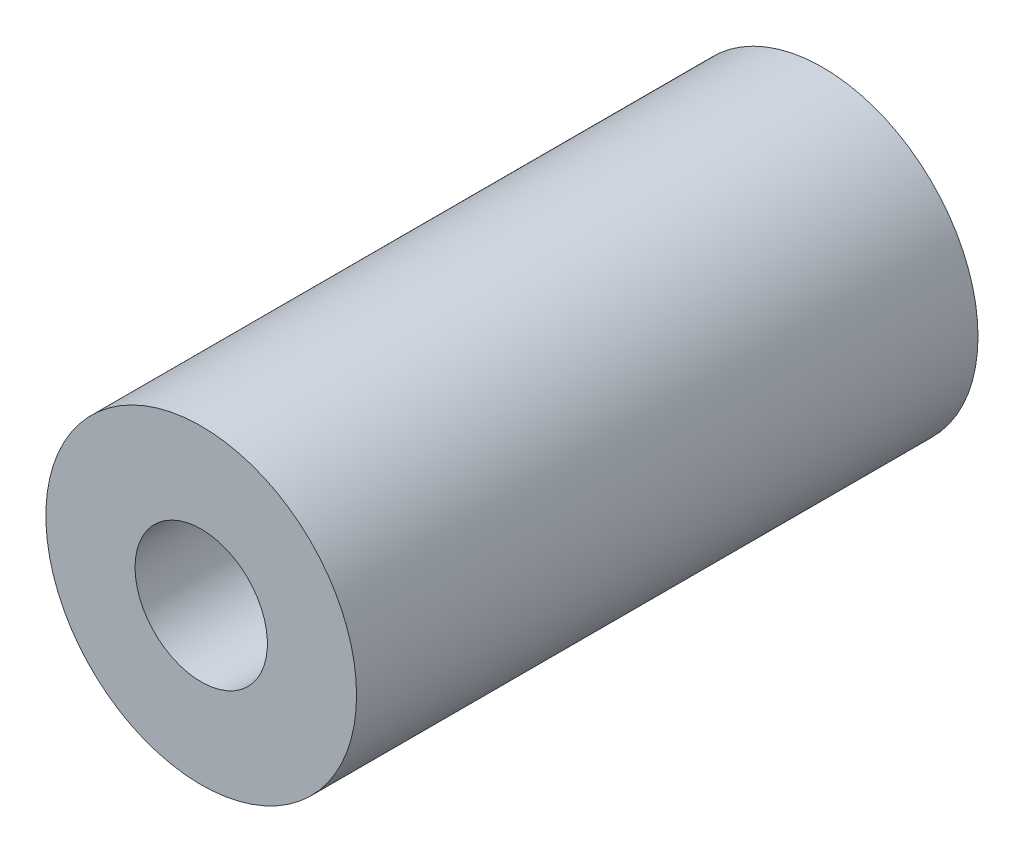
ISO-10303-21;
HEADER;
FILE_DESCRIPTION(('STEP AP214'),'2;1');
FILE_NAME('part.step','',(''),(''),'','','');
FILE_SCHEMA(('AUTOMOTIVE_DESIGN { 1 0 10303 214 1 1 1 1 }'));
ENDSEC;
DATA;
#1=APPLICATION_CONTEXT('core data for automotive mechanical design processes');
#2=APPLICATION_PROTOCOL_DEFINITION('international standard','automotive_design',2000,#1);
#3=PRODUCT_CONTEXT('',#1,'mechanical');
#4=PRODUCT('Part','Part','',(#3));
#5=PRODUCT_RELATED_PRODUCT_CATEGORY('part','',(#4));
#6=PRODUCT_DEFINITION_FORMATION('','',#4);
#7=PRODUCT_DEFINITION_CONTEXT('part definition',#1,'design');
#8=PRODUCT_DEFINITION('design','',#6,#7);
#9=PRODUCT_DEFINITION_SHAPE('','',#8);
#10=(LENGTH_UNIT() NAMED_UNIT(*) SI_UNIT(.MILLI.,.METRE.));
#11=(NAMED_UNIT(*) PLANE_ANGLE_UNIT() SI_UNIT($,.RADIAN.));
#12=(NAMED_UNIT(*) SI_UNIT($,.STERADIAN.) SOLID_ANGLE_UNIT());
#13=UNCERTAINTY_MEASURE_WITH_UNIT(LENGTH_MEASURE(1.E-05),#10,'distance_accuracy_value','');
#14=(GEOMETRIC_REPRESENTATION_CONTEXT(3) GLOBAL_UNCERTAINTY_ASSIGNED_CONTEXT((#13)) GLOBAL_UNIT_ASSIGNED_CONTEXT((#10,
#11,#12)) REPRESENTATION_CONTEXT('',''));
#15=CARTESIAN_POINT('',(0.,0.,0.));
#16=DIRECTION('',(0.,0.,1.));
#17=DIRECTION('',(1.,0.,0.));
#18=AXIS2_PLACEMENT_3D('',#15,#16,#17);
#19=CARTESIAN_POINT('',(0.,0.,12.7));
#20=DIRECTION('',(0.,0.,-1.));
#21=DIRECTION('',(-1.,0.,0.));
#22=AXIS2_PLACEMENT_3D('',#19,#20,#21);
#23=CYLINDRICAL_SURFACE('',#22,3.175);
#24=CARTESIAN_POINT('',(0.,0.,12.7));
#25=DIRECTION('',(0.,0.,1.));
#26=DIRECTION('',(1.,0.,0.));
#27=AXIS2_PLACEMENT_3D('',#24,#25,#26);
#28=CIRCLE('',#27,3.175);
#29=CARTESIAN_POINT('',(3.175,0.,12.7));
#30=VERTEX_POINT('',#29);
#31=EDGE_CURVE('E10',#30,#30,#28,.T.);
#32=ORIENTED_EDGE('',*,*,#31,.F.);
#33=EDGE_LOOP('',(#32));
#34=FACE_BOUND('',#33,.T.);
#35=CARTESIAN_POINT('',(0.,0.,0.));
#36=DIRECTION('',(0.,0.,1.));
#37=DIRECTION('',(1.,0.,0.));
#38=AXIS2_PLACEMENT_3D('',#35,#36,#37);
#39=CIRCLE('',#38,3.175);
#40=CARTESIAN_POINT('',(3.175,0.,0.));
#41=VERTEX_POINT('',#40);
#42=EDGE_CURVE('E36',#41,#41,#39,.T.);
#43=ORIENTED_EDGE('',*,*,#42,.T.);
#44=EDGE_LOOP('',(#43));
#45=FACE_BOUND('',#44,.T.);
#46=ADVANCED_FACE('F33',(#34,#45),#23,.T.);
#47=CARTESIAN_POINT('',(0.,0.,12.7));
#48=DIRECTION('',(0.,0.,1.));
#49=DIRECTION('',(1.,0.,0.));
#50=AXIS2_PLACEMENT_3D('',#47,#48,#49);
#51=PLANE('',#50);
#52=CARTESIAN_POINT('',(0.,0.,12.7));
#53=DIRECTION('',(0.,0.,-1.));
#54=DIRECTION('',(-1.,0.,0.));
#55=AXIS2_PLACEMENT_3D('',#52,#53,#54);
#56=CIRCLE('',#55,1.35255);
#57=CARTESIAN_POINT('',(-1.35255,0.,12.7));
#58=VERTEX_POINT('',#57);
#59=EDGE_CURVE('E43',#58,#58,#56,.T.);
#60=ORIENTED_EDGE('',*,*,#59,.T.);
#61=EDGE_LOOP('',(#60));
#62=FACE_BOUND('',#61,.T.);
#63=ORIENTED_EDGE('',*,*,#31,.T.);
#64=EDGE_LOOP('',(#63));
#65=FACE_BOUND('',#64,.T.);
#66=ADVANCED_FACE('F56',(#62,#65),#51,.T.);
#67=CARTESIAN_POINT('',(0.,0.,0.));
#68=DIRECTION('',(0.,0.,1.));
#69=DIRECTION('',(1.,0.,0.));
#70=AXIS2_PLACEMENT_3D('',#67,#68,#69);
#71=PLANE('',#70);
#72=CARTESIAN_POINT('',(0.,0.,0.));
#73=DIRECTION('',(0.,0.,-1.));
#74=DIRECTION('',(-1.,0.,0.));
#75=AXIS2_PLACEMENT_3D('',#72,#73,#74);
#76=CIRCLE('',#75,1.35254999999999);
#77=CARTESIAN_POINT('',(-1.35254999999999,0.,0.));
#78=VERTEX_POINT('',#77);
#79=EDGE_CURVE('E47',#78,#78,#76,.T.);
#80=ORIENTED_EDGE('',*,*,#79,.F.);
#81=EDGE_LOOP('',(#80));
#82=FACE_BOUND('',#81,.T.);
#83=ORIENTED_EDGE('',*,*,#42,.F.);
#84=EDGE_LOOP('',(#83));
#85=FACE_BOUND('',#84,.T.);
#86=ADVANCED_FACE('F53',(#82,#85),#71,.F.);
#87=CARTESIAN_POINT('',(0.,0.,0.));
#88=DIRECTION('',(0.,0.,-1.));
#89=DIRECTION('',(-1.,0.,0.));
#90=AXIS2_PLACEMENT_3D('',#87,#88,#89);
#91=CYLINDRICAL_SURFACE('',#90,1.35254999999999);
#92=ORIENTED_EDGE('',*,*,#59,.F.);
#93=EDGE_LOOP('',(#92));
#94=FACE_BOUND('',#93,.T.);
#95=ORIENTED_EDGE('',*,*,#79,.T.);
#96=EDGE_LOOP('',(#95));
#97=FACE_BOUND('',#96,.T.);
#98=ADVANCED_FACE('F51',(#94,#97),#91,.F.);
#99=CLOSED_SHELL('',(#46,#66,#86,#98));
#100=MANIFOLD_SOLID_BREP('B2',#99);
#101=ADVANCED_BREP_SHAPE_REPRESENTATION('',(#18,#100),#14);
#102=SHAPE_DEFINITION_REPRESENTATION(#9,#101);
ENDSEC;
END-ISO-10303-21;
